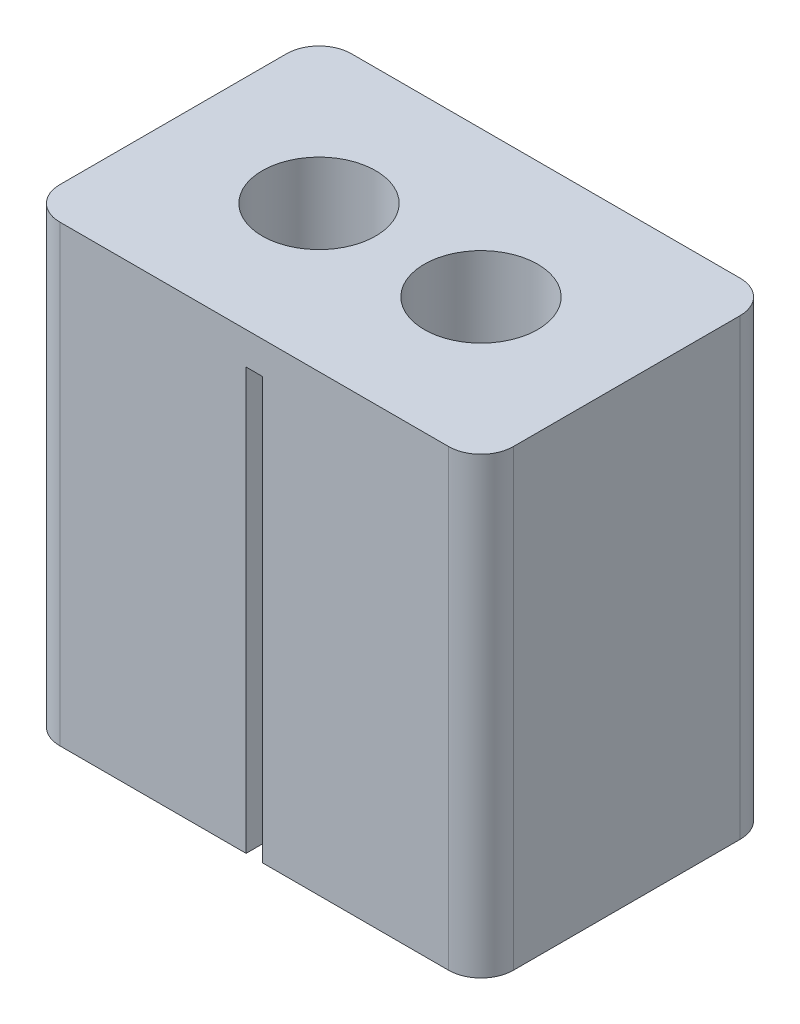
ISO-10303-21;
HEADER;
FILE_DESCRIPTION(('STEP AP214'),'2;1');
FILE_NAME('part.step','',(''),(''),'','','');
FILE_SCHEMA(('AUTOMOTIVE_DESIGN { 1 0 10303 214 1 1 1 1 }'));
ENDSEC;
DATA;
#1=APPLICATION_CONTEXT('core data for automotive mechanical design processes');
#2=APPLICATION_PROTOCOL_DEFINITION('international standard','automotive_design',2000,#1);
#3=PRODUCT_CONTEXT('',#1,'mechanical');
#4=PRODUCT('Part','Part','',(#3));
#5=PRODUCT_RELATED_PRODUCT_CATEGORY('part','',(#4));
#6=PRODUCT_DEFINITION_FORMATION('','',#4);
#7=PRODUCT_DEFINITION_CONTEXT('part definition',#1,'design');
#8=PRODUCT_DEFINITION('design','',#6,#7);
#9=PRODUCT_DEFINITION_SHAPE('','',#8);
#10=(LENGTH_UNIT() NAMED_UNIT(*) SI_UNIT(.MILLI.,.METRE.));
#11=(NAMED_UNIT(*) PLANE_ANGLE_UNIT() SI_UNIT($,.RADIAN.));
#12=(NAMED_UNIT(*) SI_UNIT($,.STERADIAN.) SOLID_ANGLE_UNIT());
#13=UNCERTAINTY_MEASURE_WITH_UNIT(LENGTH_MEASURE(1.E-05),#10,'distance_accuracy_value','');
#14=(GEOMETRIC_REPRESENTATION_CONTEXT(3) GLOBAL_UNCERTAINTY_ASSIGNED_CONTEXT((#13)) GLOBAL_UNIT_ASSIGNED_CONTEXT((#10,
#11,#12)) REPRESENTATION_CONTEXT('',''));
#15=CARTESIAN_POINT('',(0.,0.,0.));
#16=DIRECTION('',(0.,0.,1.));
#17=DIRECTION('',(1.,0.,0.));
#18=AXIS2_PLACEMENT_3D('',#15,#16,#17);
#19=CARTESIAN_POINT('',(0.,0.,0.));
#20=DIRECTION('',(0.,1.,0.));
#21=DIRECTION('',(0.,0.,1.));
#22=AXIS2_PLACEMENT_3D('',#19,#20,#21);
#23=PLANE('',#22);
#24=CARTESIAN_POINT('',(2.5,0.,0.));
#25=DIRECTION('',(0.,1.,0.));
#26=DIRECTION('',(0.,0.,1.));
#27=AXIS2_PLACEMENT_3D('',#24,#25,#26);
#28=CIRCLE('',#27,1.05);
#29=CARTESIAN_POINT('',(2.5,0.,1.05));
#30=VERTEX_POINT('',#29);
#31=EDGE_CURVE('E221',#30,#30,#28,.F.);
#32=ORIENTED_EDGE('',*,*,#31,.F.);
#33=EDGE_LOOP('',(#32));
#34=FACE_BOUND('',#33,.T.);
#35=DIRECTION('',(1.,0.,0.));
#36=VECTOR('',#35,1.);
#37=CARTESIAN_POINT('',(-7.,0.,4.5));
#38=LINE('',#37,#36);
#39=CARTESIAN_POINT('',(0.25,0.,4.5));
#40=VERTEX_POINT('',#39);
#41=CARTESIAN_POINT('',(6.,0.,4.5));
#42=VERTEX_POINT('',#41);
#43=EDGE_CURVE('E143',#40,#42,#38,.T.);
#44=ORIENTED_EDGE('',*,*,#43,.F.);
#45=DIRECTION('',(0.,0.,1.));
#46=VECTOR('',#45,1.);
#47=CARTESIAN_POINT('',(0.25,0.,4.5));
#48=LINE('',#47,#46);
#49=CARTESIAN_POINT('',(0.25,0.,-4.5));
#50=VERTEX_POINT('',#49);
#51=EDGE_CURVE('E128',#50,#40,#48,.T.);
#52=ORIENTED_EDGE('',*,*,#51,.F.);
#53=DIRECTION('',(-1.,0.,0.));
#54=VECTOR('',#53,1.);
#55=CARTESIAN_POINT('',(-7.,0.,-4.5));
#56=LINE('',#55,#54);
#57=CARTESIAN_POINT('',(6.,0.,-4.5));
#58=VERTEX_POINT('',#57);
#59=EDGE_CURVE('E141',#58,#50,#56,.T.);
#60=ORIENTED_EDGE('',*,*,#59,.F.);
#61=CARTESIAN_POINT('',(6.,0.,-3.5));
#62=DIRECTION('',(0.,1.,0.));
#63=DIRECTION('',(0.,0.,1.));
#64=AXIS2_PLACEMENT_3D('',#61,#62,#63);
#65=CIRCLE('',#64,1.);
#66=CARTESIAN_POINT('',(7.,0.,-3.5));
#67=VERTEX_POINT('',#66);
#68=EDGE_CURVE('E174',#58,#67,#65,.F.);
#69=ORIENTED_EDGE('',*,*,#68,.T.);
#70=DIRECTION('',(0.,0.,-1.));
#71=VECTOR('',#70,1.);
#72=CARTESIAN_POINT('',(7.,0.,-4.5));
#73=LINE('',#72,#71);
#74=CARTESIAN_POINT('',(7.,0.,3.5));
#75=VERTEX_POINT('',#74);
#76=EDGE_CURVE('E156',#75,#67,#73,.T.);
#77=ORIENTED_EDGE('',*,*,#76,.F.);
#78=CARTESIAN_POINT('',(6.,0.,3.5));
#79=DIRECTION('',(0.,1.,0.));
#80=DIRECTION('',(0.,0.,1.));
#81=AXIS2_PLACEMENT_3D('',#78,#79,#80);
#82=CIRCLE('',#81,1.);
#83=EDGE_CURVE('E172',#75,#42,#82,.F.);
#84=ORIENTED_EDGE('',*,*,#83,.T.);
#85=EDGE_LOOP('',(#44,#52,#60,#69,#77,#84));
#86=FACE_BOUND('',#85,.T.);
#87=ADVANCED_FACE('F37',(#34,#86),#23,.F.);
#88=CARTESIAN_POINT('',(7.,14.,-4.5));
#89=DIRECTION('',(-1.,0.,0.));
#90=DIRECTION('',(0.,0.,1.));
#91=AXIS2_PLACEMENT_3D('',#88,#89,#90);
#92=PLANE('',#91);
#93=ORIENTED_EDGE('',*,*,#76,.T.);
#94=DIRECTION('',(0.,-1.,0.));
#95=VECTOR('',#94,1.);
#96=CARTESIAN_POINT('',(7.,14.,-3.5));
#97=LINE('',#96,#95);
#98=CARTESIAN_POINT('',(7.,14.,-3.5));
#99=VERTEX_POINT('',#98);
#100=EDGE_CURVE('E193',#67,#99,#97,.F.);
#101=ORIENTED_EDGE('',*,*,#100,.T.);
#102=DIRECTION('',(0.,0.,-1.));
#103=VECTOR('',#102,1.);
#104=CARTESIAN_POINT('',(7.,14.,-4.5));
#105=LINE('',#104,#103);
#106=CARTESIAN_POINT('',(7.,14.,3.5));
#107=VERTEX_POINT('',#106);
#108=EDGE_CURVE('E163',#107,#99,#105,.T.);
#109=ORIENTED_EDGE('',*,*,#108,.F.);
#110=DIRECTION('',(0.,-1.,0.));
#111=VECTOR('',#110,1.);
#112=CARTESIAN_POINT('',(7.,14.,3.5));
#113=LINE('',#112,#111);
#114=EDGE_CURVE('E190',#107,#75,#113,.T.);
#115=ORIENTED_EDGE('',*,*,#114,.T.);
#116=EDGE_LOOP('',(#93,#101,#109,#115));
#117=FACE_BOUND('',#116,.T.);
#118=ADVANCED_FACE('F259',(#117),#92,.F.);
#119=CARTESIAN_POINT('',(-7.,14.,-4.5));
#120=DIRECTION('',(0.,0.,1.));
#121=DIRECTION('',(1.,0.,0.));
#122=AXIS2_PLACEMENT_3D('',#119,#120,#121);
#123=PLANE('',#122);
#124=ORIENTED_EDGE('',*,*,#59,.T.);
#125=DIRECTION('',(0.,1.,0.));
#126=VECTOR('',#125,1.);
#127=CARTESIAN_POINT('',(0.25,-0.000999999999999265,-4.5));
#128=LINE('',#127,#126);
#129=CARTESIAN_POINT('',(0.25,13.,-4.5));
#130=VERTEX_POINT('',#129);
#131=EDGE_CURVE('E125',#50,#130,#128,.T.);
#132=ORIENTED_EDGE('',*,*,#131,.T.);
#133=DIRECTION('',(-1.,0.,0.));
#134=VECTOR('',#133,1.);
#135=CARTESIAN_POINT('',(-0.25,13.,-4.5));
#136=LINE('',#135,#134);
#137=CARTESIAN_POINT('',(-0.25,13.,-4.5));
#138=VERTEX_POINT('',#137);
#139=EDGE_CURVE('E209',#130,#138,#136,.T.);
#140=ORIENTED_EDGE('',*,*,#139,.T.);
#141=DIRECTION('',(0.,1.,0.));
#142=VECTOR('',#141,1.);
#143=CARTESIAN_POINT('',(-0.25,-0.000999999999999265,-4.5));
#144=LINE('',#143,#142);
#145=CARTESIAN_POINT('',(-0.25,0.,-4.5));
#146=VERTEX_POINT('',#145);
#147=EDGE_CURVE('E135',#146,#138,#144,.T.);
#148=ORIENTED_EDGE('',*,*,#147,.F.);
#149=CARTESIAN_POINT('',(-6.,0.,-4.5));
#150=VERTEX_POINT('',#149);
#151=EDGE_CURVE('E152',#146,#150,#56,.T.);
#152=ORIENTED_EDGE('',*,*,#151,.T.);
#153=DIRECTION('',(0.,-1.,0.));
#154=VECTOR('',#153,1.);
#155=CARTESIAN_POINT('',(-6.,14.,-4.5));
#156=LINE('',#155,#154);
#157=CARTESIAN_POINT('',(-6.,14.,-4.5));
#158=VERTEX_POINT('',#157);
#159=EDGE_CURVE('E180',#150,#158,#156,.F.);
#160=ORIENTED_EDGE('',*,*,#159,.T.);
#161=DIRECTION('',(-1.,0.,0.));
#162=VECTOR('',#161,1.);
#163=CARTESIAN_POINT('',(-7.,14.,-4.5));
#164=LINE('',#163,#162);
#165=CARTESIAN_POINT('',(6.,14.,-4.5));
#166=VERTEX_POINT('',#165);
#167=EDGE_CURVE('E244',#166,#158,#164,.T.);
#168=ORIENTED_EDGE('',*,*,#167,.F.);
#169=DIRECTION('',(0.,-1.,0.));
#170=VECTOR('',#169,1.);
#171=CARTESIAN_POINT('',(6.,14.,-4.5));
#172=LINE('',#171,#170);
#173=EDGE_CURVE('E150',#166,#58,#172,.T.);
#174=ORIENTED_EDGE('',*,*,#173,.T.);
#175=EDGE_LOOP('',(#124,#132,#140,#148,#152,#160,#168,#174));
#176=FACE_BOUND('',#175,.T.);
#177=ADVANCED_FACE('F147',(#176),#123,.F.);
#178=CARTESIAN_POINT('',(-7.,14.,-4.5));
#179=DIRECTION('',(1.,0.,0.));
#180=DIRECTION('',(0.,0.,-1.));
#181=AXIS2_PLACEMENT_3D('',#178,#179,#180);
#182=PLANE('',#181);
#183=DIRECTION('',(0.,0.,1.));
#184=VECTOR('',#183,1.);
#185=CARTESIAN_POINT('',(-7.,14.,-4.5));
#186=LINE('',#185,#184);
#187=CARTESIAN_POINT('',(-7.,14.,-3.5));
#188=VERTEX_POINT('',#187);
#189=CARTESIAN_POINT('',(-7.,14.,3.5));
#190=VERTEX_POINT('',#189);
#191=EDGE_CURVE('E247',#188,#190,#186,.T.);
#192=ORIENTED_EDGE('',*,*,#191,.F.);
#193=DIRECTION('',(0.,-1.,0.));
#194=VECTOR('',#193,1.);
#195=CARTESIAN_POINT('',(-7.,14.,-3.5));
#196=LINE('',#195,#194);
#197=CARTESIAN_POINT('',(-7.,0.,-3.5));
#198=VERTEX_POINT('',#197);
#199=EDGE_CURVE('E166',#188,#198,#196,.T.);
#200=ORIENTED_EDGE('',*,*,#199,.T.);
#201=DIRECTION('',(0.,0.,1.));
#202=VECTOR('',#201,1.);
#203=CARTESIAN_POINT('',(-7.,0.,-4.5));
#204=LINE('',#203,#202);
#205=CARTESIAN_POINT('',(-7.,0.,3.5));
#206=VERTEX_POINT('',#205);
#207=EDGE_CURVE('E151',#198,#206,#204,.T.);
#208=ORIENTED_EDGE('',*,*,#207,.T.);
#209=DIRECTION('',(0.,-1.,0.));
#210=VECTOR('',#209,1.);
#211=CARTESIAN_POINT('',(-7.,14.,3.5));
#212=LINE('',#211,#210);
#213=EDGE_CURVE('E164',#206,#190,#212,.F.);
#214=ORIENTED_EDGE('',*,*,#213,.T.);
#215=EDGE_LOOP('',(#192,#200,#208,#214));
#216=FACE_BOUND('',#215,.T.);
#217=ADVANCED_FACE('F271',(#216),#182,.F.);
#218=CARTESIAN_POINT('',(-7.,14.,4.5));
#219=DIRECTION('',(0.,0.,-1.));
#220=DIRECTION('',(-1.,0.,0.));
#221=AXIS2_PLACEMENT_3D('',#218,#219,#220);
#222=PLANE('',#221);
#223=DIRECTION('',(1.,0.,0.));
#224=VECTOR('',#223,1.);
#225=CARTESIAN_POINT('',(-0.25,13.,4.5));
#226=LINE('',#225,#224);
#227=CARTESIAN_POINT('',(-0.25,13.,4.5));
#228=VERTEX_POINT('',#227);
#229=CARTESIAN_POINT('',(0.25,13.,4.5));
#230=VERTEX_POINT('',#229);
#231=EDGE_CURVE('E136',#228,#230,#226,.T.);
#232=ORIENTED_EDGE('',*,*,#231,.T.);
#233=DIRECTION('',(0.,1.,0.));
#234=VECTOR('',#233,1.);
#235=CARTESIAN_POINT('',(0.25,-0.000999999999999265,4.5));
#236=LINE('',#235,#234);
#237=EDGE_CURVE('E214',#40,#230,#236,.T.);
#238=ORIENTED_EDGE('',*,*,#237,.F.);
#239=ORIENTED_EDGE('',*,*,#43,.T.);
#240=DIRECTION('',(0.,-1.,0.));
#241=VECTOR('',#240,1.);
#242=CARTESIAN_POINT('',(6.,14.,4.5));
#243=LINE('',#242,#241);
#244=CARTESIAN_POINT('',(6.,14.,4.5));
#245=VERTEX_POINT('',#244);
#246=EDGE_CURVE('E11',#42,#245,#243,.F.);
#247=ORIENTED_EDGE('',*,*,#246,.T.);
#248=DIRECTION('',(1.,0.,0.));
#249=VECTOR('',#248,1.);
#250=CARTESIAN_POINT('',(-7.,14.,4.5));
#251=LINE('',#250,#249);
#252=CARTESIAN_POINT('',(-6.,14.,4.5));
#253=VERTEX_POINT('',#252);
#254=EDGE_CURVE('E167',#253,#245,#251,.T.);
#255=ORIENTED_EDGE('',*,*,#254,.F.);
#256=DIRECTION('',(0.,-1.,0.));
#257=VECTOR('',#256,1.);
#258=CARTESIAN_POINT('',(-6.,14.,4.5));
#259=LINE('',#258,#257);
#260=CARTESIAN_POINT('',(-6.,0.,4.5));
#261=VERTEX_POINT('',#260);
#262=EDGE_CURVE('E45',#253,#261,#259,.T.);
#263=ORIENTED_EDGE('',*,*,#262,.T.);
#264=CARTESIAN_POINT('',(-0.25,0.,4.5));
#265=VERTEX_POINT('',#264);
#266=EDGE_CURVE('E160',#261,#265,#38,.T.);
#267=ORIENTED_EDGE('',*,*,#266,.T.);
#268=DIRECTION('',(0.,1.,0.));
#269=VECTOR('',#268,1.);
#270=CARTESIAN_POINT('',(-0.25,-0.000999999999999265,4.5));
#271=LINE('',#270,#269);
#272=EDGE_CURVE('E52',#265,#228,#271,.T.);
#273=ORIENTED_EDGE('',*,*,#272,.T.);
#274=EDGE_LOOP('',(#232,#238,#239,#247,#255,#263,#267,#273));
#275=FACE_BOUND('',#274,.T.);
#276=ADVANCED_FACE('F198',(#275),#222,.F.);
#277=CARTESIAN_POINT('',(0.,14.,0.));
#278=DIRECTION('',(0.,1.,0.));
#279=DIRECTION('',(0.,0.,1.));
#280=AXIS2_PLACEMENT_3D('',#277,#278,#279);
#281=PLANE('',#280);
#282=CARTESIAN_POINT('',(2.5,14.,0.));
#283=DIRECTION('',(0.,1.,0.));
#284=DIRECTION('',(0.,0.,-1.));
#285=AXIS2_PLACEMENT_3D('',#282,#283,#284);
#286=CIRCLE('',#285,1.75);
#287=CARTESIAN_POINT('',(2.5,14.,-1.75));
#288=VERTEX_POINT('',#287);
#289=EDGE_CURVE('E230',#288,#288,#286,.T.);
#290=ORIENTED_EDGE('',*,*,#289,.F.);
#291=EDGE_LOOP('',(#290));
#292=FACE_BOUND('',#291,.T.);
#293=CARTESIAN_POINT('',(-2.5,14.,0.));
#294=DIRECTION('',(0.,1.,0.));
#295=DIRECTION('',(0.,0.,1.));
#296=AXIS2_PLACEMENT_3D('',#293,#294,#295);
#297=CIRCLE('',#296,1.75);
#298=CARTESIAN_POINT('',(-2.5,14.,1.75));
#299=VERTEX_POINT('',#298);
#300=EDGE_CURVE('E234',#299,#299,#297,.T.);
#301=ORIENTED_EDGE('',*,*,#300,.F.);
#302=EDGE_LOOP('',(#301));
#303=FACE_BOUND('',#302,.T.);
#304=ORIENTED_EDGE('',*,*,#167,.T.);
#305=CARTESIAN_POINT('',(-6.,14.,-3.5));
#306=DIRECTION('',(0.,1.,0.));
#307=DIRECTION('',(0.,0.,1.));
#308=AXIS2_PLACEMENT_3D('',#305,#306,#307);
#309=CIRCLE('',#308,1.);
#310=EDGE_CURVE('E188',#158,#188,#309,.T.);
#311=ORIENTED_EDGE('',*,*,#310,.T.);
#312=ORIENTED_EDGE('',*,*,#191,.T.);
#313=CARTESIAN_POINT('',(-6.,14.,3.5));
#314=DIRECTION('',(0.,1.,0.));
#315=DIRECTION('',(0.,0.,1.));
#316=AXIS2_PLACEMENT_3D('',#313,#314,#315);
#317=CIRCLE('',#316,1.);
#318=EDGE_CURVE('E182',#190,#253,#317,.T.);
#319=ORIENTED_EDGE('',*,*,#318,.T.);
#320=ORIENTED_EDGE('',*,*,#254,.T.);
#321=CARTESIAN_POINT('',(6.,14.,3.5));
#322=DIRECTION('',(0.,1.,0.));
#323=DIRECTION('',(0.,0.,1.));
#324=AXIS2_PLACEMENT_3D('',#321,#322,#323);
#325=CIRCLE('',#324,1.);
#326=EDGE_CURVE('E184',#245,#107,#325,.T.);
#327=ORIENTED_EDGE('',*,*,#326,.T.);
#328=ORIENTED_EDGE('',*,*,#108,.T.);
#329=CARTESIAN_POINT('',(6.,14.,-3.5));
#330=DIRECTION('',(0.,1.,0.));
#331=DIRECTION('',(0.,0.,1.));
#332=AXIS2_PLACEMENT_3D('',#329,#330,#331);
#333=CIRCLE('',#332,1.);
#334=EDGE_CURVE('E186',#99,#166,#333,.T.);
#335=ORIENTED_EDGE('',*,*,#334,.T.);
#336=EDGE_LOOP('',(#304,#311,#312,#319,#320,#327,#328,#335));
#337=FACE_BOUND('',#336,.T.);
#338=ADVANCED_FACE('F251',(#292,#303,#337),#281,.T.);
#339=CARTESIAN_POINT('',(-2.5,0.,0.));
#340=DIRECTION('',(0.,1.,0.));
#341=DIRECTION('',(0.,0.,1.));
#342=AXIS2_PLACEMENT_3D('',#339,#340,#341);
#343=CIRCLE('',#342,1.05);
#344=CARTESIAN_POINT('',(-2.5,0.,1.05));
#345=VERTEX_POINT('',#344);
#346=EDGE_CURVE('E227',#345,#345,#343,.F.);
#347=ORIENTED_EDGE('',*,*,#346,.F.);
#348=EDGE_LOOP('',(#347));
#349=FACE_BOUND('',#348,.T.);
#350=ORIENTED_EDGE('',*,*,#151,.F.);
#351=DIRECTION('',(0.,0.,-1.));
#352=VECTOR('',#351,1.);
#353=CARTESIAN_POINT('',(-0.25,0.,4.5));
#354=LINE('',#353,#352);
#355=EDGE_CURVE('E144',#265,#146,#354,.T.);
#356=ORIENTED_EDGE('',*,*,#355,.F.);
#357=ORIENTED_EDGE('',*,*,#266,.F.);
#358=CARTESIAN_POINT('',(-6.,0.,3.5));
#359=DIRECTION('',(0.,1.,0.));
#360=DIRECTION('',(0.,0.,1.));
#361=AXIS2_PLACEMENT_3D('',#358,#359,#360);
#362=CIRCLE('',#361,1.);
#363=EDGE_CURVE('E170',#261,#206,#362,.F.);
#364=ORIENTED_EDGE('',*,*,#363,.T.);
#365=ORIENTED_EDGE('',*,*,#207,.F.);
#366=CARTESIAN_POINT('',(-6.,0.,-3.5));
#367=DIRECTION('',(0.,1.,0.));
#368=DIRECTION('',(0.,0.,1.));
#369=AXIS2_PLACEMENT_3D('',#366,#367,#368);
#370=CIRCLE('',#369,1.);
#371=EDGE_CURVE('E176',#198,#150,#370,.F.);
#372=ORIENTED_EDGE('',*,*,#371,.T.);
#373=EDGE_LOOP('',(#350,#356,#357,#364,#365,#372));
#374=FACE_BOUND('',#373,.T.);
#375=ADVANCED_FACE('F203',(#349,#374),#23,.F.);
#376=CARTESIAN_POINT('',(-6.,14.,-3.5));
#377=DIRECTION('',(0.,-1.,0.));
#378=DIRECTION('',(0.,0.,-1.));
#379=AXIS2_PLACEMENT_3D('',#376,#377,#378);
#380=CYLINDRICAL_SURFACE('',#379,1.);
#381=ORIENTED_EDGE('',*,*,#310,.F.);
#382=ORIENTED_EDGE('',*,*,#159,.F.);
#383=ORIENTED_EDGE('',*,*,#371,.F.);
#384=ORIENTED_EDGE('',*,*,#199,.F.);
#385=EDGE_LOOP('',(#381,#382,#383,#384));
#386=FACE_BOUND('',#385,.T.);
#387=ADVANCED_FACE('F267',(#386),#380,.T.);
#388=CARTESIAN_POINT('',(6.,14.,-3.5));
#389=DIRECTION('',(0.,-1.,0.));
#390=DIRECTION('',(0.,0.,-1.));
#391=AXIS2_PLACEMENT_3D('',#388,#389,#390);
#392=CYLINDRICAL_SURFACE('',#391,1.);
#393=ORIENTED_EDGE('',*,*,#334,.F.);
#394=ORIENTED_EDGE('',*,*,#100,.F.);
#395=ORIENTED_EDGE('',*,*,#68,.F.);
#396=ORIENTED_EDGE('',*,*,#173,.F.);
#397=EDGE_LOOP('',(#393,#394,#395,#396));
#398=FACE_BOUND('',#397,.T.);
#399=ADVANCED_FACE('F263',(#398),#392,.T.);
#400=CARTESIAN_POINT('',(6.,14.,3.5));
#401=DIRECTION('',(0.,-1.,0.));
#402=DIRECTION('',(0.,0.,-1.));
#403=AXIS2_PLACEMENT_3D('',#400,#401,#402);
#404=CYLINDRICAL_SURFACE('',#403,1.);
#405=ORIENTED_EDGE('',*,*,#326,.F.);
#406=ORIENTED_EDGE('',*,*,#246,.F.);
#407=ORIENTED_EDGE('',*,*,#83,.F.);
#408=ORIENTED_EDGE('',*,*,#114,.F.);
#409=EDGE_LOOP('',(#405,#406,#407,#408));
#410=FACE_BOUND('',#409,.T.);
#411=ADVANCED_FACE('F255',(#410),#404,.T.);
#412=CARTESIAN_POINT('',(-6.,14.,3.5));
#413=DIRECTION('',(0.,-1.,0.));
#414=DIRECTION('',(0.,0.,-1.));
#415=AXIS2_PLACEMENT_3D('',#412,#413,#414);
#416=CYLINDRICAL_SURFACE('',#415,1.);
#417=ORIENTED_EDGE('',*,*,#318,.F.);
#418=ORIENTED_EDGE('',*,*,#213,.F.);
#419=ORIENTED_EDGE('',*,*,#363,.F.);
#420=ORIENTED_EDGE('',*,*,#262,.F.);
#421=EDGE_LOOP('',(#417,#418,#419,#420));
#422=FACE_BOUND('',#421,.T.);
#423=ADVANCED_FACE('F39',(#422),#416,.T.);
#424=CARTESIAN_POINT('',(-2.5,7.,0.));
#425=DIRECTION('',(0.,1.,0.));
#426=DIRECTION('',(0.,0.,1.));
#427=AXIS2_PLACEMENT_3D('',#424,#425,#426);
#428=CYLINDRICAL_SURFACE('',#427,1.75);
#429=CARTESIAN_POINT('',(-2.5,7.,0.));
#430=DIRECTION('',(0.,1.,0.));
#431=DIRECTION('',(0.,0.,1.));
#432=AXIS2_PLACEMENT_3D('',#429,#430,#431);
#433=CIRCLE('',#432,1.75);
#434=CARTESIAN_POINT('',(-2.5,7.,1.75));
#435=VERTEX_POINT('',#434);
#436=EDGE_CURVE('E237',#435,#435,#433,.T.);
#437=ORIENTED_EDGE('',*,*,#436,.F.);
#438=EDGE_LOOP('',(#437));
#439=FACE_BOUND('',#438,.T.);
#440=ORIENTED_EDGE('',*,*,#300,.T.);
#441=EDGE_LOOP('',(#440));
#442=FACE_BOUND('',#441,.T.);
#443=ADVANCED_FACE('F274',(#439,#442),#428,.F.);
#444=CARTESIAN_POINT('',(-2.5,7.,0.));
#445=DIRECTION('',(0.,1.,0.));
#446=DIRECTION('',(0.,0.,1.));
#447=AXIS2_PLACEMENT_3D('',#444,#445,#446);
#448=PLANE('',#447);
#449=CARTESIAN_POINT('',(-2.5,7.,0.));
#450=DIRECTION('',(0.,1.,0.));
#451=DIRECTION('',(0.,0.,1.));
#452=AXIS2_PLACEMENT_3D('',#449,#450,#451);
#453=CIRCLE('',#452,1.05);
#454=CARTESIAN_POINT('',(-2.5,7.,1.05));
#455=VERTEX_POINT('',#454);
#456=EDGE_CURVE('E224',#455,#455,#453,.T.);
#457=ORIENTED_EDGE('',*,*,#456,.F.);
#458=EDGE_LOOP('',(#457));
#459=FACE_BOUND('',#458,.T.);
#460=ORIENTED_EDGE('',*,*,#436,.T.);
#461=EDGE_LOOP('',(#460));
#462=FACE_BOUND('',#461,.T.);
#463=ADVANCED_FACE('F279',(#459,#462),#448,.T.);
#464=CARTESIAN_POINT('',(2.5,7.,0.));
#465=DIRECTION('',(0.,1.,0.));
#466=DIRECTION('',(0.,0.,1.));
#467=AXIS2_PLACEMENT_3D('',#464,#465,#466);
#468=CYLINDRICAL_SURFACE('',#467,1.75);
#469=CARTESIAN_POINT('',(2.5,7.,0.));
#470=DIRECTION('',(0.,1.,0.));
#471=DIRECTION('',(0.,0.,-1.));
#472=AXIS2_PLACEMENT_3D('',#469,#470,#471);
#473=CIRCLE('',#472,1.75);
#474=CARTESIAN_POINT('',(2.5,7.,-1.75));
#475=VERTEX_POINT('',#474);
#476=EDGE_CURVE('E231',#475,#475,#473,.T.);
#477=ORIENTED_EDGE('',*,*,#476,.F.);
#478=EDGE_LOOP('',(#477));
#479=FACE_BOUND('',#478,.T.);
#480=ORIENTED_EDGE('',*,*,#289,.T.);
#481=EDGE_LOOP('',(#480));
#482=FACE_BOUND('',#481,.T.);
#483=ADVANCED_FACE('F314',(#479,#482),#468,.F.);
#484=CARTESIAN_POINT('',(2.5,7.,0.));
#485=DIRECTION('',(0.,-1.,0.));
#486=DIRECTION('',(0.,0.,-1.));
#487=AXIS2_PLACEMENT_3D('',#484,#485,#486);
#488=PLANE('',#487);
#489=CARTESIAN_POINT('',(2.5,7.,0.));
#490=DIRECTION('',(0.,1.,0.));
#491=DIRECTION('',(0.,0.,1.));
#492=AXIS2_PLACEMENT_3D('',#489,#490,#491);
#493=CIRCLE('',#492,1.05);
#494=CARTESIAN_POINT('',(2.5,7.,1.05));
#495=VERTEX_POINT('',#494);
#496=EDGE_CURVE('E216',#495,#495,#493,.T.);
#497=ORIENTED_EDGE('',*,*,#496,.F.);
#498=EDGE_LOOP('',(#497));
#499=FACE_BOUND('',#498,.T.);
#500=ORIENTED_EDGE('',*,*,#476,.T.);
#501=EDGE_LOOP('',(#500));
#502=FACE_BOUND('',#501,.T.);
#503=ADVANCED_FACE('F305',(#499,#502),#488,.F.);
#504=CARTESIAN_POINT('',(-2.5,-0.00100000000000013,0.));
#505=DIRECTION('',(0.,1.,0.));
#506=DIRECTION('',(0.,0.,1.));
#507=AXIS2_PLACEMENT_3D('',#504,#505,#506);
#508=CYLINDRICAL_SURFACE('',#507,1.05);
#509=ORIENTED_EDGE('',*,*,#456,.T.);
#510=EDGE_LOOP('',(#509));
#511=FACE_BOUND('',#510,.T.);
#512=ORIENTED_EDGE('',*,*,#346,.T.);
#513=EDGE_LOOP('',(#512));
#514=FACE_BOUND('',#513,.T.);
#515=ADVANCED_FACE('F302',(#511,#514),#508,.F.);
#516=CARTESIAN_POINT('',(2.5,-0.00100000000000013,0.));
#517=DIRECTION('',(0.,1.,0.));
#518=DIRECTION('',(0.,0.,1.));
#519=AXIS2_PLACEMENT_3D('',#516,#517,#518);
#520=CYLINDRICAL_SURFACE('',#519,1.05);
#521=ORIENTED_EDGE('',*,*,#496,.T.);
#522=EDGE_LOOP('',(#521));
#523=FACE_BOUND('',#522,.T.);
#524=ORIENTED_EDGE('',*,*,#31,.T.);
#525=EDGE_LOOP('',(#524));
#526=FACE_BOUND('',#525,.T.);
#527=ADVANCED_FACE('F304',(#523,#526),#520,.F.);
#528=CARTESIAN_POINT('',(0.25,-0.000999999999999265,4.5));
#529=DIRECTION('',(1.,0.,0.));
#530=DIRECTION('',(0.,0.,-1.));
#531=AXIS2_PLACEMENT_3D('',#528,#529,#530);
#532=PLANE('',#531);
#533=ORIENTED_EDGE('',*,*,#51,.T.);
#534=ORIENTED_EDGE('',*,*,#237,.T.);
#535=DIRECTION('',(0.,0.,-1.));
#536=VECTOR('',#535,1.);
#537=CARTESIAN_POINT('',(0.25,13.,4.5));
#538=LINE('',#537,#536);
#539=EDGE_CURVE('E131',#230,#130,#538,.T.);
#540=ORIENTED_EDGE('',*,*,#539,.T.);
#541=ORIENTED_EDGE('',*,*,#131,.F.);
#542=EDGE_LOOP('',(#533,#534,#540,#541));
#543=FACE_BOUND('',#542,.T.);
#544=ADVANCED_FACE('F127',(#543),#532,.F.);
#545=CARTESIAN_POINT('',(-0.25,-0.000999999999999265,4.5));
#546=DIRECTION('',(-1.,0.,0.));
#547=DIRECTION('',(0.,0.,1.));
#548=AXIS2_PLACEMENT_3D('',#545,#546,#547);
#549=PLANE('',#548);
#550=ORIENTED_EDGE('',*,*,#355,.T.);
#551=ORIENTED_EDGE('',*,*,#147,.T.);
#552=DIRECTION('',(0.,0.,1.));
#553=VECTOR('',#552,1.);
#554=CARTESIAN_POINT('',(-0.25,13.,4.5));
#555=LINE('',#554,#553);
#556=EDGE_CURVE('E211',#138,#228,#555,.T.);
#557=ORIENTED_EDGE('',*,*,#556,.T.);
#558=ORIENTED_EDGE('',*,*,#272,.F.);
#559=EDGE_LOOP('',(#550,#551,#557,#558));
#560=FACE_BOUND('',#559,.T.);
#561=ADVANCED_FACE('F389',(#560),#549,.F.);
#562=CARTESIAN_POINT('',(0.,13.,0.));
#563=DIRECTION('',(0.,-1.,0.));
#564=DIRECTION('',(0.,0.,-1.));
#565=AXIS2_PLACEMENT_3D('',#562,#563,#564);
#566=PLANE('',#565);
#567=ORIENTED_EDGE('',*,*,#539,.F.);
#568=ORIENTED_EDGE('',*,*,#231,.F.);
#569=ORIENTED_EDGE('',*,*,#556,.F.);
#570=ORIENTED_EDGE('',*,*,#139,.F.);
#571=EDGE_LOOP('',(#567,#568,#569,#570));
#572=FACE_BOUND('',#571,.T.);
#573=ADVANCED_FACE('F397',(#572),#566,.T.);
#574=CLOSED_SHELL('',(#87,#118,#177,#217,#276,#338,#375,#387,#399,#411,#423,#443,#463,#483,#503,
#515,#527,#544,#561,#573));
#575=MANIFOLD_SOLID_BREP('B2',#574);
#576=ADVANCED_BREP_SHAPE_REPRESENTATION('',(#18,#575),#14);
#577=SHAPE_DEFINITION_REPRESENTATION(#9,#576);
ENDSEC;
END-ISO-10303-21;
